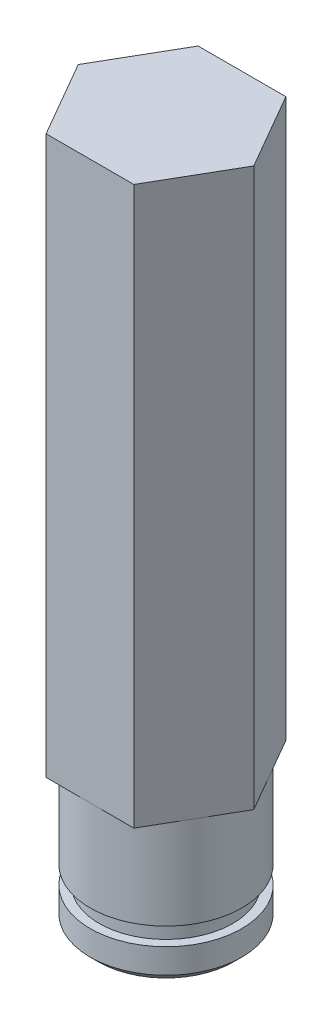
ISO-10303-21;
HEADER;
FILE_DESCRIPTION(('STEP AP214'),'2;1');
FILE_NAME('part.step','',(''),(''),'','','');
FILE_SCHEMA(('AUTOMOTIVE_DESIGN { 1 0 10303 214 1 1 1 1 }'));
ENDSEC;
DATA;
#1=APPLICATION_CONTEXT('core data for automotive mechanical design processes');
#2=APPLICATION_PROTOCOL_DEFINITION('international standard','automotive_design',2000,#1);
#3=PRODUCT_CONTEXT('',#1,'mechanical');
#4=PRODUCT('Part','Part','',(#3));
#5=PRODUCT_RELATED_PRODUCT_CATEGORY('part','',(#4));
#6=PRODUCT_DEFINITION_FORMATION('','',#4);
#7=PRODUCT_DEFINITION_CONTEXT('part definition',#1,'design');
#8=PRODUCT_DEFINITION('design','',#6,#7);
#9=PRODUCT_DEFINITION_SHAPE('','',#8);
#10=(LENGTH_UNIT() NAMED_UNIT(*) SI_UNIT(.MILLI.,.METRE.));
#11=(NAMED_UNIT(*) PLANE_ANGLE_UNIT() SI_UNIT($,.RADIAN.));
#12=(NAMED_UNIT(*) SI_UNIT($,.STERADIAN.) SOLID_ANGLE_UNIT());
#13=UNCERTAINTY_MEASURE_WITH_UNIT(LENGTH_MEASURE(1.E-05),#10,'distance_accuracy_value','');
#14=(GEOMETRIC_REPRESENTATION_CONTEXT(3) GLOBAL_UNCERTAINTY_ASSIGNED_CONTEXT((#13)) GLOBAL_UNIT_ASSIGNED_CONTEXT((#10,
#11,#12)) REPRESENTATION_CONTEXT('',''));
#15=CARTESIAN_POINT('',(0.,0.,0.));
#16=DIRECTION('',(0.,0.,1.));
#17=DIRECTION('',(1.,0.,0.));
#18=AXIS2_PLACEMENT_3D('',#15,#16,#17);
#19=CARTESIAN_POINT('',(-39.2241243202131,-43.815,-16.6661167863655));
#20=DIRECTION('',(0.,1.,0.));
#21=DIRECTION('',(0.,0.,1.));
#22=AXIS2_PLACEMENT_3D('',#19,#20,#21);
#23=PLANE('',#22);
#24=CARTESIAN_POINT('',(-39.2241243202131,-43.8149999999951,-16.6661167863655));
#25=DIRECTION('',(0.,1.,0.));
#26=DIRECTION('',(0.,0.,1.));
#27=AXIS2_PLACEMENT_3D('',#24,#25,#26);
#28=CIRCLE('',#27,4.24180000008541);
#29=CARTESIAN_POINT('',(-39.2241243202131,-43.8149999999951,-12.4243167862801));
#30=VERTEX_POINT('',#29);
#31=EDGE_CURVE('E20',#30,#30,#28,.T.);
#32=ORIENTED_EDGE('',*,*,#31,.F.);
#33=EDGE_LOOP('',(#32));
#34=FACE_BOUND('',#33,.T.);
#35=ADVANCED_FACE('F17',(#34),#23,.F.);
#36=CARTESIAN_POINT('',(-39.2241243202131,-43.3070000000271,-16.6661167863655));
#37=DIRECTION('',(0.,1.,0.));
#38=DIRECTION('',(0.,0.,1.));
#39=AXIS2_PLACEMENT_3D('',#36,#37,#38);
#40=CONICAL_SURFACE('',#39,4.74980000005339,0.785398163397448);
#41=CARTESIAN_POINT('',(-39.2241243202131,-43.307,-16.6661167863655));
#42=DIRECTION('',(0.,-1.,0.));
#43=DIRECTION('',(0.,0.,-1.));
#44=AXIS2_PLACEMENT_3D('',#41,#42,#43);
#45=CIRCLE('',#44,4.7498);
#46=CARTESIAN_POINT('',(-39.2241243202131,-43.307,-21.4159167863655));
#47=VERTEX_POINT('',#46);
#48=EDGE_CURVE('E98',#47,#47,#45,.F.);
#49=ORIENTED_EDGE('',*,*,#48,.F.);
#50=EDGE_LOOP('',(#49));
#51=FACE_BOUND('',#50,.T.);
#52=ORIENTED_EDGE('',*,*,#31,.T.);
#53=EDGE_LOOP('',(#52));
#54=FACE_BOUND('',#53,.T.);
#55=ADVANCED_FACE('F123',(#51,#54),#40,.T.);
#56=CARTESIAN_POINT('',(-39.2241243202131,-43.815,-16.6661167863655));
#57=DIRECTION('',(0.,-1.,0.));
#58=DIRECTION('',(0.,0.,-1.));
#59=AXIS2_PLACEMENT_3D('',#56,#57,#58);
#60=CYLINDRICAL_SURFACE('',#59,4.7498);
#61=CARTESIAN_POINT('',(-39.2241243202131,-41.7576,-16.6661167863655));
#62=DIRECTION('',(0.,-1.,0.));
#63=DIRECTION('',(0.,0.,-1.));
#64=AXIS2_PLACEMENT_3D('',#61,#62,#63);
#65=CIRCLE('',#64,4.7498);
#66=CARTESIAN_POINT('',(-39.2241243202131,-41.7576,-21.4159167863655));
#67=VERTEX_POINT('',#66);
#68=EDGE_CURVE('E101',#67,#67,#65,.F.);
#69=ORIENTED_EDGE('',*,*,#68,.F.);
#70=EDGE_LOOP('',(#69));
#71=FACE_BOUND('',#70,.T.);
#72=ORIENTED_EDGE('',*,*,#48,.T.);
#73=EDGE_LOOP('',(#72));
#74=FACE_BOUND('',#73,.T.);
#75=ADVANCED_FACE('F120',(#71,#74),#60,.T.);
#76=CARTESIAN_POINT('',(-43.4151243202131,-41.7576,-16.6661167863655));
#77=DIRECTION('',(0.,1.,0.));
#78=DIRECTION('',(0.,0.,1.));
#79=AXIS2_PLACEMENT_3D('',#76,#77,#78);
#80=PLANE('',#79);
#81=CARTESIAN_POINT('',(-39.2241243202131,-41.7576,-16.6661167863655));
#82=DIRECTION('',(0.,-1.,0.));
#83=DIRECTION('',(0.,0.,-1.));
#84=AXIS2_PLACEMENT_3D('',#81,#82,#83);
#85=CIRCLE('',#84,4.19100000000001);
#86=CARTESIAN_POINT('',(-39.2241243202131,-41.7576,-20.8571167863655));
#87=VERTEX_POINT('',#86);
#88=EDGE_CURVE('E113',#87,#87,#85,.F.);
#89=ORIENTED_EDGE('',*,*,#88,.F.);
#90=EDGE_LOOP('',(#89));
#91=FACE_BOUND('',#90,.T.);
#92=ORIENTED_EDGE('',*,*,#68,.T.);
#93=EDGE_LOOP('',(#92));
#94=FACE_BOUND('',#93,.T.);
#95=ADVANCED_FACE('F118',(#91,#94),#80,.T.);
#96=CARTESIAN_POINT('',(-39.2241243202131,-34.925,-16.6661167863655));
#97=DIRECTION('',(0.,-1.,0.));
#98=DIRECTION('',(0.,0.,-1.));
#99=AXIS2_PLACEMENT_3D('',#96,#97,#98);
#100=CYLINDRICAL_SURFACE('',#99,4.19100000000001);
#101=CARTESIAN_POINT('',(-39.2241243202131,-40.64,-16.6661167863655));
#102=DIRECTION('',(0.,-1.,0.));
#103=DIRECTION('',(0.,0.,-1.));
#104=AXIS2_PLACEMENT_3D('',#101,#102,#103);
#105=CIRCLE('',#104,4.19100000000001);
#106=CARTESIAN_POINT('',(-39.2241243202131,-40.64,-20.8571167863655));
#107=VERTEX_POINT('',#106);
#108=EDGE_CURVE('E110',#107,#107,#105,.F.);
#109=ORIENTED_EDGE('',*,*,#108,.F.);
#110=EDGE_LOOP('',(#109));
#111=FACE_BOUND('',#110,.T.);
#112=ORIENTED_EDGE('',*,*,#88,.T.);
#113=EDGE_LOOP('',(#112));
#114=FACE_BOUND('',#113,.T.);
#115=ADVANCED_FACE('F172',(#111,#114),#100,.T.);
#116=CARTESIAN_POINT('',(-48.1119346650407,-40.64,-16.6661167863655));
#117=DIRECTION('',(0.,-1.,0.));
#118=DIRECTION('',(0.,0.,-1.));
#119=AXIS2_PLACEMENT_3D('',#116,#117,#118);
#120=PLANE('',#119);
#121=CARTESIAN_POINT('',(-39.2241243202131,-40.64,-16.6661167863655));
#122=DIRECTION('',(0.,-1.,0.));
#123=DIRECTION('',(0.,0.,-1.));
#124=AXIS2_PLACEMENT_3D('',#121,#122,#123);
#125=CIRCLE('',#124,4.7498);
#126=CARTESIAN_POINT('',(-39.2241243202131,-40.64,-21.4159167863655));
#127=VERTEX_POINT('',#126);
#128=EDGE_CURVE('E86',#127,#127,#125,.F.);
#129=ORIENTED_EDGE('',*,*,#128,.F.);
#130=EDGE_LOOP('',(#129));
#131=FACE_BOUND('',#130,.T.);
#132=ORIENTED_EDGE('',*,*,#108,.T.);
#133=EDGE_LOOP('',(#132));
#134=FACE_BOUND('',#133,.T.);
#135=ADVANCED_FACE('F168',(#131,#134),#120,.T.);
#136=CARTESIAN_POINT('',(-39.2241243202131,-43.815,-16.6661167863655));
#137=DIRECTION('',(0.,-1.,0.));
#138=DIRECTION('',(0.,0.,-1.));
#139=AXIS2_PLACEMENT_3D('',#136,#137,#138);
#140=CYLINDRICAL_SURFACE('',#139,4.7498);
#141=ORIENTED_EDGE('',*,*,#128,.T.);
#142=EDGE_LOOP('',(#141));
#143=FACE_BOUND('',#142,.T.);
#144=CARTESIAN_POINT('',(-39.2241243202131,-34.925,-16.6661167863655));
#145=DIRECTION('',(0.,-1.,0.));
#146=DIRECTION('',(0.,0.,-1.));
#147=AXIS2_PLACEMENT_3D('',#144,#145,#146);
#148=CIRCLE('',#147,4.7498);
#149=CARTESIAN_POINT('',(-39.2241243202131,-34.925,-21.4159167863655));
#150=VERTEX_POINT('',#149);
#151=EDGE_CURVE('E104',#150,#150,#148,.F.);
#152=ORIENTED_EDGE('',*,*,#151,.F.);
#153=EDGE_LOOP('',(#152));
#154=FACE_BOUND('',#153,.T.);
#155=ADVANCED_FACE('F165',(#143,#154),#140,.T.);
#156=CARTESIAN_POINT('',(-41.9737549772287,-34.925,-21.4286167863655));
#157=DIRECTION('',(-0.866025403784438,0.,-0.500000000000001));
#158=DIRECTION('',(-0.500000000000001,0.,0.866025403784438));
#159=AXIS2_PLACEMENT_3D('',#156,#157,#158);
#160=PLANE('',#159);
#161=DIRECTION('',(0.500000000000001,0.,-0.866025403784438));
#162=VECTOR('',#161,1.);
#163=CARTESIAN_POINT('',(-44.7233856342443,-34.925,-16.6661167863655));
#164=LINE('',#163,#162);
#165=CARTESIAN_POINT('',(-44.7233856342443,-34.925,-16.6661167863655));
#166=VERTEX_POINT('',#165);
#167=CARTESIAN_POINT('',(-41.9737549772287,-34.925,-21.4286167863655));
#168=VERTEX_POINT('',#167);
#169=EDGE_CURVE('E288',#166,#168,#164,.T.);
#170=ORIENTED_EDGE('',*,*,#169,.F.);
#171=DIRECTION('',(0.,1.,0.));
#172=VECTOR('',#171,1.);
#173=CARTESIAN_POINT('',(-44.7233856342443,-34.925,-16.6661167863655));
#174=LINE('',#173,#172);
#175=CARTESIAN_POINT('',(-44.7233856342443,0.,-16.6661167863655));
#176=VERTEX_POINT('',#175);
#177=EDGE_CURVE('E77',#176,#166,#174,.F.);
#178=ORIENTED_EDGE('',*,*,#177,.F.);
#179=DIRECTION('',(0.500000000000001,0.,-0.866025403784438));
#180=VECTOR('',#179,1.);
#181=CARTESIAN_POINT('',(-44.7233856342443,0.,-16.6661167863655));
#182=LINE('',#181,#180);
#183=CARTESIAN_POINT('',(-41.9737549772287,0.,-21.4286167863655));
#184=VERTEX_POINT('',#183);
#185=EDGE_CURVE('E72',#176,#184,#182,.T.);
#186=ORIENTED_EDGE('',*,*,#185,.T.);
#187=DIRECTION('',(0.,1.,0.));
#188=VECTOR('',#187,1.);
#189=CARTESIAN_POINT('',(-41.9737549772287,-34.925,-21.4286167863655));
#190=LINE('',#189,#188);
#191=EDGE_CURVE('E75',#168,#184,#190,.T.);
#192=ORIENTED_EDGE('',*,*,#191,.F.);
#193=EDGE_LOOP('',(#170,#178,#186,#192));
#194=FACE_BOUND('',#193,.T.);
#195=ADVANCED_FACE('F74',(#194),#160,.T.);
#196=CARTESIAN_POINT('',(-36.4744936631975,-34.925,-21.4286167863655));
#197=DIRECTION('',(0.,0.,-1.));
#198=DIRECTION('',(-1.,0.,0.));
#199=AXIS2_PLACEMENT_3D('',#196,#197,#198);
#200=PLANE('',#199);
#201=DIRECTION('',(1.,0.,0.));
#202=VECTOR('',#201,1.);
#203=CARTESIAN_POINT('',(-44.7233856342443,-34.925,-21.4286167863655));
#204=LINE('',#203,#202);
#205=CARTESIAN_POINT('',(-36.4744936631975,-34.925,-21.4286167863655));
#206=VERTEX_POINT('',#205);
#207=EDGE_CURVE('E84',#168,#206,#204,.T.);
#208=ORIENTED_EDGE('',*,*,#207,.F.);
#209=ORIENTED_EDGE('',*,*,#191,.T.);
#210=DIRECTION('',(1.,0.,0.));
#211=VECTOR('',#210,1.);
#212=CARTESIAN_POINT('',(-44.7233856342443,0.,-21.4286167863655));
#213=LINE('',#212,#211);
#214=CARTESIAN_POINT('',(-36.4744936631975,0.,-21.4286167863655));
#215=VERTEX_POINT('',#214);
#216=EDGE_CURVE('E67',#184,#215,#213,.T.);
#217=ORIENTED_EDGE('',*,*,#216,.T.);
#218=DIRECTION('',(0.,1.,0.));
#219=VECTOR('',#218,1.);
#220=CARTESIAN_POINT('',(-36.4744936631975,-34.925,-21.4286167863655));
#221=LINE('',#220,#219);
#222=EDGE_CURVE('E80',#206,#215,#221,.T.);
#223=ORIENTED_EDGE('',*,*,#222,.F.);
#224=EDGE_LOOP('',(#208,#209,#217,#223));
#225=FACE_BOUND('',#224,.T.);
#226=ADVANCED_FACE('F82',(#225),#200,.T.);
#227=CARTESIAN_POINT('',(-33.7248630061819,-34.925,-16.6661167863655));
#228=DIRECTION('',(0.866025403784439,0.,-0.5));
#229=DIRECTION('',(-0.5,0.,-0.866025403784439));
#230=AXIS2_PLACEMENT_3D('',#227,#228,#229);
#231=PLANE('',#230);
#232=DIRECTION('',(0.500000000000002,0.,0.866025403784438));
#233=VECTOR('',#232,1.);
#234=CARTESIAN_POINT('',(-36.4744936631975,-34.925,-21.4286167863655));
#235=LINE('',#234,#233);
#236=CARTESIAN_POINT('',(-33.7248630061819,-34.925,-16.6661167863655));
#237=VERTEX_POINT('',#236);
#238=EDGE_CURVE('E282',#206,#237,#235,.T.);
#239=ORIENTED_EDGE('',*,*,#238,.F.);
#240=ORIENTED_EDGE('',*,*,#222,.T.);
#241=DIRECTION('',(0.500000000000002,0.,0.866025403784438));
#242=VECTOR('',#241,1.);
#243=CARTESIAN_POINT('',(-36.4744936631975,0.,-21.4286167863655));
#244=LINE('',#243,#242);
#245=CARTESIAN_POINT('',(-33.7248630061819,0.,-16.6661167863655));
#246=VERTEX_POINT('',#245);
#247=EDGE_CURVE('E91',#215,#246,#244,.T.);
#248=ORIENTED_EDGE('',*,*,#247,.T.);
#249=DIRECTION('',(0.,1.,0.));
#250=VECTOR('',#249,1.);
#251=CARTESIAN_POINT('',(-33.7248630061819,-34.925,-16.6661167863655));
#252=LINE('',#251,#250);
#253=EDGE_CURVE('E284',#237,#246,#252,.T.);
#254=ORIENTED_EDGE('',*,*,#253,.F.);
#255=EDGE_LOOP('',(#239,#240,#248,#254));
#256=FACE_BOUND('',#255,.T.);
#257=ADVANCED_FACE('F157',(#256),#231,.T.);
#258=CARTESIAN_POINT('',(-44.7233856342443,0.,-16.6661167863655));
#259=DIRECTION('',(0.,-1.,0.));
#260=DIRECTION('',(0.,0.,-1.));
#261=AXIS2_PLACEMENT_3D('',#258,#259,#260);
#262=PLANE('',#261);
#263=DIRECTION('',(1.,0.,0.));
#264=VECTOR('',#263,1.);
#265=CARTESIAN_POINT('',(-41.9737549772287,0.,-11.9036167863655));
#266=LINE('',#265,#264);
#267=CARTESIAN_POINT('',(-36.4744936631975,0.,-11.9036167863655));
#268=VERTEX_POINT('',#267);
#269=CARTESIAN_POINT('',(-41.9737549772287,0.,-11.9036167863655));
#270=VERTEX_POINT('',#269);
#271=EDGE_CURVE('E298',#268,#270,#266,.F.);
#272=ORIENTED_EDGE('',*,*,#271,.F.);
#273=DIRECTION('',(0.500000000000001,0.,-0.866025403784438));
#274=VECTOR('',#273,1.);
#275=CARTESIAN_POINT('',(-36.4744936631975,0.,-11.9036167863655));
#276=LINE('',#275,#274);
#277=EDGE_CURVE('E285',#246,#268,#276,.F.);
#278=ORIENTED_EDGE('',*,*,#277,.F.);
#279=ORIENTED_EDGE('',*,*,#247,.F.);
#280=ORIENTED_EDGE('',*,*,#216,.F.);
#281=ORIENTED_EDGE('',*,*,#185,.F.);
#282=DIRECTION('',(0.5,0.,0.866025403784439));
#283=VECTOR('',#282,1.);
#284=CARTESIAN_POINT('',(-44.7233856342443,0.,-16.6661167863655));
#285=LINE('',#284,#283);
#286=EDGE_CURVE('E93',#270,#176,#285,.F.);
#287=ORIENTED_EDGE('',*,*,#286,.F.);
#288=EDGE_LOOP('',(#272,#278,#279,#280,#281,#287));
#289=FACE_BOUND('',#288,.T.);
#290=ADVANCED_FACE('F89',(#289),#262,.F.);
#291=CARTESIAN_POINT('',(-44.7233856342443,-34.925,-16.6661167863655));
#292=DIRECTION('',(-0.866025403784439,0.,0.5));
#293=DIRECTION('',(0.5,0.,0.866025403784439));
#294=AXIS2_PLACEMENT_3D('',#291,#292,#293);
#295=PLANE('',#294);
#296=DIRECTION('',(-0.500000000000001,0.,-0.866025403784438));
#297=VECTOR('',#296,1.);
#298=CARTESIAN_POINT('',(-41.9737549772287,-34.925,-11.9036167863655));
#299=LINE('',#298,#297);
#300=CARTESIAN_POINT('',(-41.9737549772287,-34.925,-11.9036167863655));
#301=VERTEX_POINT('',#300);
#302=EDGE_CURVE('E107',#301,#166,#299,.T.);
#303=ORIENTED_EDGE('',*,*,#302,.F.);
#304=DIRECTION('',(0.,1.,0.));
#305=VECTOR('',#304,1.);
#306=CARTESIAN_POINT('',(-41.9737549772287,-34.925,-11.9036167863655));
#307=LINE('',#306,#305);
#308=EDGE_CURVE('E296',#270,#301,#307,.F.);
#309=ORIENTED_EDGE('',*,*,#308,.F.);
#310=ORIENTED_EDGE('',*,*,#286,.T.);
#311=ORIENTED_EDGE('',*,*,#177,.T.);
#312=EDGE_LOOP('',(#303,#309,#310,#311));
#313=FACE_BOUND('',#312,.T.);
#314=ADVANCED_FACE('F151',(#313),#295,.T.);
#315=CARTESIAN_POINT('',(-44.7233856342443,-34.925,-16.6661167863655));
#316=DIRECTION('',(0.,-1.,0.));
#317=DIRECTION('',(0.,0.,-1.));
#318=AXIS2_PLACEMENT_3D('',#315,#316,#317);
#319=PLANE('',#318);
#320=DIRECTION('',(0.500000000000001,0.,-0.866025403784438));
#321=VECTOR('',#320,1.);
#322=CARTESIAN_POINT('',(-36.4744936631975,-34.925,-11.9036167863655));
#323=LINE('',#322,#321);
#324=CARTESIAN_POINT('',(-36.4744936631975,-34.925,-11.9036167863655));
#325=VERTEX_POINT('',#324);
#326=EDGE_CURVE('E35',#325,#237,#323,.T.);
#327=ORIENTED_EDGE('',*,*,#326,.F.);
#328=DIRECTION('',(1.,0.,0.));
#329=VECTOR('',#328,1.);
#330=CARTESIAN_POINT('',(-41.9737549772287,-34.925,-11.9036167863655));
#331=LINE('',#330,#329);
#332=EDGE_CURVE('E26',#301,#325,#331,.T.);
#333=ORIENTED_EDGE('',*,*,#332,.F.);
#334=ORIENTED_EDGE('',*,*,#302,.T.);
#335=ORIENTED_EDGE('',*,*,#169,.T.);
#336=ORIENTED_EDGE('',*,*,#207,.T.);
#337=ORIENTED_EDGE('',*,*,#238,.T.);
#338=EDGE_LOOP('',(#327,#333,#334,#335,#336,#337));
#339=FACE_BOUND('',#338,.T.);
#340=ORIENTED_EDGE('',*,*,#151,.T.);
#341=EDGE_LOOP('',(#340));
#342=FACE_BOUND('',#341,.T.);
#343=ADVANCED_FACE('F144',(#339,#342),#319,.T.);
#344=CARTESIAN_POINT('',(-36.4744936631975,-34.925,-11.9036167863655));
#345=DIRECTION('',(0.866025403784438,0.,0.500000000000001));
#346=DIRECTION('',(0.500000000000001,0.,-0.866025403784438));
#347=AXIS2_PLACEMENT_3D('',#344,#345,#346);
#348=PLANE('',#347);
#349=ORIENTED_EDGE('',*,*,#326,.T.);
#350=ORIENTED_EDGE('',*,*,#253,.T.);
#351=ORIENTED_EDGE('',*,*,#277,.T.);
#352=DIRECTION('',(0.,1.,0.));
#353=VECTOR('',#352,1.);
#354=CARTESIAN_POINT('',(-36.4744936631975,-34.925,-11.9036167863655));
#355=LINE('',#354,#353);
#356=EDGE_CURVE('E11',#325,#268,#355,.T.);
#357=ORIENTED_EDGE('',*,*,#356,.F.);
#358=EDGE_LOOP('',(#349,#350,#351,#357));
#359=FACE_BOUND('',#358,.T.);
#360=ADVANCED_FACE('F138',(#359),#348,.T.);
#361=CARTESIAN_POINT('',(-41.9737549772287,-34.925,-11.9036167863655));
#362=DIRECTION('',(0.,0.,1.));
#363=DIRECTION('',(1.,0.,0.));
#364=AXIS2_PLACEMENT_3D('',#361,#362,#363);
#365=PLANE('',#364);
#366=ORIENTED_EDGE('',*,*,#332,.T.);
#367=ORIENTED_EDGE('',*,*,#356,.T.);
#368=ORIENTED_EDGE('',*,*,#271,.T.);
#369=ORIENTED_EDGE('',*,*,#308,.T.);
#370=EDGE_LOOP('',(#366,#367,#368,#369));
#371=FACE_BOUND('',#370,.T.);
#372=ADVANCED_FACE('F136',(#371),#365,.T.);
#373=CLOSED_SHELL('',(#35,#55,#75,#95,#115,#135,#155,#195,#226,#257,#290,#314,#343,#360,#372));
#374=MANIFOLD_SOLID_BREP('B1',#373);
#375=ADVANCED_BREP_SHAPE_REPRESENTATION('',(#18,#374),#14);
#376=SHAPE_DEFINITION_REPRESENTATION(#9,#375);
ENDSEC;
END-ISO-10303-21;
